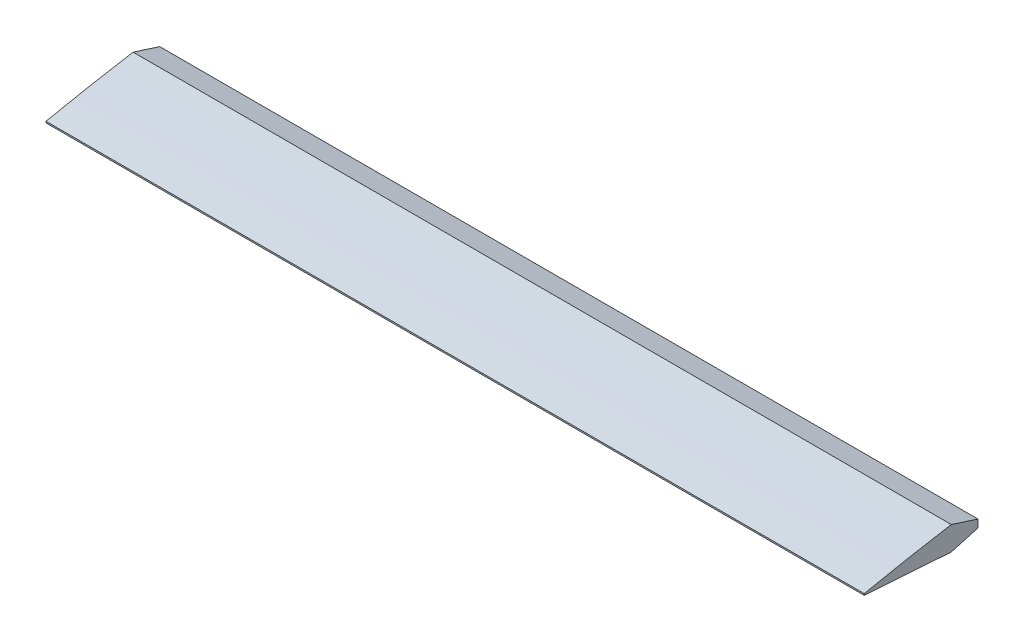
ISO-10303-21;
HEADER;
FILE_DESCRIPTION(('STEP AP214'),'2;1');
FILE_NAME('part.step','',(''),(''),'','','');
FILE_SCHEMA(('AUTOMOTIVE_DESIGN { 1 0 10303 214 1 1 1 1 }'));
ENDSEC;
DATA;
#1=APPLICATION_CONTEXT('core data for automotive mechanical design processes');
#2=APPLICATION_PROTOCOL_DEFINITION('international standard','automotive_design',2000,#1);
#3=PRODUCT_CONTEXT('',#1,'mechanical');
#4=PRODUCT('Part','Part','',(#3));
#5=PRODUCT_RELATED_PRODUCT_CATEGORY('part','',(#4));
#6=PRODUCT_DEFINITION_FORMATION('','',#4);
#7=PRODUCT_DEFINITION_CONTEXT('part definition',#1,'design');
#8=PRODUCT_DEFINITION('design','',#6,#7);
#9=PRODUCT_DEFINITION_SHAPE('','',#8);
#10=(LENGTH_UNIT() NAMED_UNIT(*) SI_UNIT(.MILLI.,.METRE.));
#11=(NAMED_UNIT(*) PLANE_ANGLE_UNIT() SI_UNIT($,.RADIAN.));
#12=(NAMED_UNIT(*) SI_UNIT($,.STERADIAN.) SOLID_ANGLE_UNIT());
#13=UNCERTAINTY_MEASURE_WITH_UNIT(LENGTH_MEASURE(1.E-05),#10,'distance_accuracy_value','');
#14=(GEOMETRIC_REPRESENTATION_CONTEXT(3) GLOBAL_UNCERTAINTY_ASSIGNED_CONTEXT((#13)) GLOBAL_UNIT_ASSIGNED_CONTEXT((#10,
#11,#12)) REPRESENTATION_CONTEXT('',''));
#15=CARTESIAN_POINT('',(0.,0.,0.));
#16=DIRECTION('',(0.,0.,1.));
#17=DIRECTION('',(1.,0.,0.));
#18=AXIS2_PLACEMENT_3D('',#15,#16,#17);
#19=CARTESIAN_POINT('',(-250.,21.3886732850242,89.));
#20=CARTESIAN_POINT('',(-250.,21.6924393138106,87.5175902156763));
#21=CARTESIAN_POINT('',(-250.,22.2991735538198,84.5566640796384));
#22=CARTESIAN_POINT('',(-250.,23.4104909631112,78.6297269469736));
#23=CARTESIAN_POINT('',(-250.,24.641831569462,71.2170631809324));
#24=CARTESIAN_POINT('',(-250.,25.9162390672229,62.3159799477099));
#25=CARTESIAN_POINT('',(-250.,26.9790478293723,53.4163650243348));
#26=CARTESIAN_POINT('',(-250.,27.757252312656,44.5128917718668));
#27=CARTESIAN_POINT('',(-250.,28.2842497525229,35.6114461447732));
#28=CARTESIAN_POINT('',(-250.,28.3734546736372,28.1847004811248));
#29=CARTESIAN_POINT('',(-250.,28.1277297242642,22.2491575224991));
#30=CARTESIAN_POINT('',(-250.,27.7676716658709,17.7938603249267));
#31=CARTESIAN_POINT('',(-250.,27.1974963055456,13.3329383648118));
#32=CARTESIAN_POINT('',(-250.,26.4953694537602,9.62034210956704));
#33=CARTESIAN_POINT('',(-250.,25.701015566182,6.66058751576171));
#34=CARTESIAN_POINT('',(-250.,24.9788303768218,4.4166755350325));
#35=CARTESIAN_POINT('',(-250.,24.1373761617376,2.51552543990555));
#36=CARTESIAN_POINT('',(-250.,23.1172060054036,0.875610555548998));
#37=CARTESIAN_POINT('',(-250.,21.3529663487488,-0.554450875401541));
#38=CARTESIAN_POINT('',(-250.,19.8022315361252,0.931001928104729));
#39=CARTESIAN_POINT('',(-250.,19.0949550918379,2.54024256096899));
#40=CARTESIAN_POINT('',(-250.,18.5577036137218,4.43302859202716));
#41=CARTESIAN_POINT('',(-250.,18.1724928525861,6.66955299200507));
#42=CARTESIAN_POINT('',(-250.,17.8437583770492,9.64115310370391));
#43=CARTESIAN_POINT('',(-250.,17.590735707999,13.3504314681179));
#44=CARTESIAN_POINT('',(-250.,17.4892914666729,17.8043187113869));
#45=CARTESIAN_POINT('',(-250.,17.5034280625483,22.2550272141336));
#46=CARTESIAN_POINT('',(-250.,17.6344002740936,28.1885067397123));
#47=CARTESIAN_POINT('',(-250.,17.8700772068071,35.6060485187279));
#48=CARTESIAN_POINT('',(-250.,18.280226492312,44.5059981210921));
#49=CARTESIAN_POINT('',(-250.,18.8133186654621,53.4033670106579));
#50=CARTESIAN_POINT('',(-250.,19.3674253006102,62.3022449763705));
#51=CARTESIAN_POINT('',(-250.,19.9283008784247,71.2026444966919));
#52=CARTESIAN_POINT('',(-250.,20.4448648269986,78.6172037371231));
#53=CARTESIAN_POINT('',(-250.,20.8433000555565,84.5506800402072));
#54=CARTESIAN_POINT('',(-250.,21.052621242818,87.5168254487195));
#55=CARTESIAN_POINT('',(-250.,21.1572890238036,89.));
#56=B_SPLINE_CURVE_WITH_KNOTS('',3,(#19,#20,#21,#22,#23,#24,#25,#26,#27,#28,#29,#30,#31,#32,#33,
#34,#35,#36,#37,#38,#39,#40,#41,#42,#43,#44,#45,#46,#47,#48,#49,#50,#51,#52,#53,#54,#55),
.UNSPECIFIED.,.F.,.F.,(4,1,1,1,1,1,1,1,1,1,1,1,1,1,1,1,1,1,1,1,1,1,1,1,1,1,1,1,1,1,1,1,1,1,4),
(0.,0.0250124897498648,0.0499592861642578,0.0996729249269686,0.149206319909966,
0.198581096615965,0.247805170456833,0.296916574601493,0.345952721793533,0.370491625569911,
0.395091203654929,0.41981479582396,0.444798575016595,0.457489818915221,0.47040640543549,
0.483879408669829,0.491264120322896,0.503458853294665,0.513609129403887,0.520450990700287,
0.533235387615153,0.545691039147803,0.558031884237173,0.582609167247894,0.607134741746914,
0.631652079836766,0.656174271859652,0.705233949250519,0.754320378530032,0.803437363555032,
0.852566095729537,0.901700994033255,0.950848809337271,0.975422716989279,1.),.UNSPECIFIED.);
#57=DIRECTION('',(1.,0.,0.));
#58=VECTOR('',#57,1.);
#59=SURFACE_OF_LINEAR_EXTRUSION('',#56,#58);
#60=CARTESIAN_POINT('',(-101.,21.3886732850242,89.));
#61=CARTESIAN_POINT('',(-101.,21.6924393138106,87.5175902156763));
#62=CARTESIAN_POINT('',(-101.,22.2991735538198,84.5566640796384));
#63=CARTESIAN_POINT('',(-101.,23.4104909631112,78.6297269469736));
#64=CARTESIAN_POINT('',(-101.,24.641831569462,71.2170631809324));
#65=CARTESIAN_POINT('',(-101.,25.9162390672229,62.3159799477099));
#66=CARTESIAN_POINT('',(-101.,26.9790478293723,53.4163650243348));
#67=CARTESIAN_POINT('',(-101.,27.757252312656,44.5128917718668));
#68=CARTESIAN_POINT('',(-101.,28.2842497525229,35.6114461447732));
#69=CARTESIAN_POINT('',(-101.,28.3734546736372,28.1847004811248));
#70=CARTESIAN_POINT('',(-101.,28.1277297242642,22.2491575224991));
#71=CARTESIAN_POINT('',(-101.,27.7676716658709,17.7938603249267));
#72=CARTESIAN_POINT('',(-101.,27.1974963055456,13.3329383648118));
#73=CARTESIAN_POINT('',(-101.,26.4953694537602,9.62034210956704));
#74=CARTESIAN_POINT('',(-101.,25.701015566182,6.66058751576171));
#75=CARTESIAN_POINT('',(-101.,24.9788303768218,4.4166755350325));
#76=CARTESIAN_POINT('',(-101.,24.1373761617376,2.51552543990555));
#77=CARTESIAN_POINT('',(-101.,23.1172060054036,0.875610555548998));
#78=CARTESIAN_POINT('',(-101.,21.3529663487488,-0.554450875401541));
#79=CARTESIAN_POINT('',(-101.,19.8022315361252,0.931001928104729));
#80=CARTESIAN_POINT('',(-101.,19.0949550918379,2.54024256096899));
#81=CARTESIAN_POINT('',(-101.,18.5577036137218,4.43302859202716));
#82=CARTESIAN_POINT('',(-101.,18.1724928525861,6.66955299200507));
#83=CARTESIAN_POINT('',(-101.,17.8437583770492,9.64115310370391));
#84=CARTESIAN_POINT('',(-101.,17.590735707999,13.3504314681179));
#85=CARTESIAN_POINT('',(-101.,17.4892914666729,17.8043187113869));
#86=CARTESIAN_POINT('',(-101.,17.5034280625483,22.2550272141336));
#87=CARTESIAN_POINT('',(-101.,17.6344002740936,28.1885067397123));
#88=CARTESIAN_POINT('',(-101.,17.8700772068071,35.6060485187279));
#89=CARTESIAN_POINT('',(-101.,18.280226492312,44.5059981210921));
#90=CARTESIAN_POINT('',(-101.,18.8133186654621,53.4033670106579));
#91=CARTESIAN_POINT('',(-101.,19.3674253006102,62.3022449763705));
#92=CARTESIAN_POINT('',(-101.,19.9283008784247,71.2026444966919));
#93=CARTESIAN_POINT('',(-101.,20.4448648269986,78.6172037371231));
#94=CARTESIAN_POINT('',(-101.,20.8433000555565,84.5506800402072));
#95=CARTESIAN_POINT('',(-101.,21.052621242818,87.5168254487195));
#96=CARTESIAN_POINT('',(-101.,21.1572890238036,89.));
#97=B_SPLINE_CURVE_WITH_KNOTS('',3,(#60,#61,#62,#63,#64,#65,#66,#67,#68,#69,#70,#71,#72,#73,#74,
#75,#76,#77,#78,#79,#80,#81,#82,#83,#84,#85,#86,#87,#88,#89,#90,#91,#92,#93,#94,#95,#96),
.UNSPECIFIED.,.F.,.F.,(4,1,1,1,1,1,1,1,1,1,1,1,1,1,1,1,1,1,1,1,1,1,1,1,1,1,1,1,1,1,1,1,1,1,4),
(0.,0.0250124897498648,0.0499592861642578,0.0996729249269686,0.149206319909966,
0.198581096615965,0.247805170456833,0.296916574601493,0.345952721793533,0.370491625569911,
0.395091203654929,0.41981479582396,0.444798575016595,0.457489818915221,0.47040640543549,
0.483879408669829,0.491264120322896,0.503458853294665,0.513609129403887,0.520450990700287,
0.533235387615153,0.545691039147803,0.558031884237173,0.582609167247894,0.607134741746914,
0.631652079836766,0.656174271859652,0.705233949250519,0.754320378530032,0.803437363555032,
0.852566095729537,0.901700994033255,0.950848809337271,0.975422716989279,1.),.UNSPECIFIED.);
#98=CARTESIAN_POINT('',(-101.,21.3886732850242,89.));
#99=VERTEX_POINT('',#98);
#100=CARTESIAN_POINT('',(-101.,23.9416394535555,75.375229743475));
#101=VERTEX_POINT('',#100);
#102=EDGE_CURVE('E127',#99,#101,#97,.T.);
#103=ORIENTED_EDGE('',*,*,#102,.T.);
#104=DIRECTION('',(-1.,0.,0.));
#105=VECTOR('',#104,1.);
#106=CARTESIAN_POINT('',(-101.,23.941639457081,75.3752297227453));
#107=LINE('',#106,#105);
#108=CARTESIAN_POINT('',(-229.,23.941639457081,75.3752297227453));
#109=VERTEX_POINT('',#108);
#110=EDGE_CURVE('E70',#101,#109,#107,.T.);
#111=ORIENTED_EDGE('',*,*,#110,.T.);
#112=CARTESIAN_POINT('',(-229.,21.3886732850242,89.));
#113=CARTESIAN_POINT('',(-229.,21.6924393138106,87.5175902156763));
#114=CARTESIAN_POINT('',(-229.,22.2991735538198,84.5566640796384));
#115=CARTESIAN_POINT('',(-229.,23.4104909631112,78.6297269469736));
#116=CARTESIAN_POINT('',(-229.,24.641831569462,71.2170631809324));
#117=CARTESIAN_POINT('',(-229.,25.9162390672229,62.3159799477099));
#118=CARTESIAN_POINT('',(-229.,26.9790478293723,53.4163650243348));
#119=CARTESIAN_POINT('',(-229.,27.757252312656,44.5128917718668));
#120=CARTESIAN_POINT('',(-229.,28.2842497525229,35.6114461447732));
#121=CARTESIAN_POINT('',(-229.,28.3734546736372,28.1847004811248));
#122=CARTESIAN_POINT('',(-229.,28.1277297242642,22.2491575224991));
#123=CARTESIAN_POINT('',(-229.,27.7676716658709,17.7938603249267));
#124=CARTESIAN_POINT('',(-229.,27.1974963055456,13.3329383648118));
#125=CARTESIAN_POINT('',(-229.,26.4953694537602,9.62034210956704));
#126=CARTESIAN_POINT('',(-229.,25.701015566182,6.66058751576171));
#127=CARTESIAN_POINT('',(-229.,24.9788303768218,4.4166755350325));
#128=CARTESIAN_POINT('',(-229.,24.1373761617376,2.51552543990555));
#129=CARTESIAN_POINT('',(-229.,23.1172060054036,0.875610555548998));
#130=CARTESIAN_POINT('',(-229.,21.3529663487488,-0.554450875401541));
#131=CARTESIAN_POINT('',(-229.,19.8022315361252,0.931001928104729));
#132=CARTESIAN_POINT('',(-229.,19.0949550918379,2.54024256096899));
#133=CARTESIAN_POINT('',(-229.,18.5577036137218,4.43302859202716));
#134=CARTESIAN_POINT('',(-229.,18.1724928525861,6.66955299200507));
#135=CARTESIAN_POINT('',(-229.,17.8437583770492,9.64115310370391));
#136=CARTESIAN_POINT('',(-229.,17.590735707999,13.3504314681179));
#137=CARTESIAN_POINT('',(-229.,17.4892914666729,17.8043187113869));
#138=CARTESIAN_POINT('',(-229.,17.5034280625483,22.2550272141336));
#139=CARTESIAN_POINT('',(-229.,17.6344002740936,28.1885067397123));
#140=CARTESIAN_POINT('',(-229.,17.8700772068071,35.6060485187279));
#141=CARTESIAN_POINT('',(-229.,18.280226492312,44.5059981210921));
#142=CARTESIAN_POINT('',(-229.,18.8133186654621,53.4033670106579));
#143=CARTESIAN_POINT('',(-229.,19.3674253006102,62.3022449763705));
#144=CARTESIAN_POINT('',(-229.,19.9283008784247,71.2026444966919));
#145=CARTESIAN_POINT('',(-229.,20.4448648269986,78.6172037371231));
#146=CARTESIAN_POINT('',(-229.,20.8433000555565,84.5506800402072));
#147=CARTESIAN_POINT('',(-229.,21.052621242818,87.5168254487195));
#148=CARTESIAN_POINT('',(-229.,21.1572890238036,89.));
#149=B_SPLINE_CURVE_WITH_KNOTS('',3,(#112,#113,#114,#115,#116,#117,#118,#119,#120,#121,#122,
#123,#124,#125,#126,#127,#128,#129,#130,#131,#132,#133,#134,#135,#136,#137,#138,#139,#140,#141,
#142,#143,#144,#145,#146,#147,#148),.UNSPECIFIED.,.F.,.F.,(4,1,1,1,1,1,1,1,1,1,1,1,1,1,1,1,1,1,
1,1,1,1,1,1,1,1,1,1,1,1,1,1,1,1,4),(0.,0.0250124897498648,0.0499592861642578,0.0996729249269686,
0.149206319909966,0.198581096615965,0.247805170456833,0.296916574601493,0.345952721793533,
0.370491625569911,0.395091203654929,0.41981479582396,0.444798575016595,0.457489818915221,
0.47040640543549,0.483879408669829,0.491264120322896,0.503458853294665,0.513609129403887,
0.520450990700287,0.533235387615153,0.545691039147803,0.558031884237173,0.582609167247894,
0.607134741746914,0.631652079836766,0.656174271859652,0.705233949250519,0.754320378530032,
0.803437363555032,0.852566095729537,0.901700994033255,0.950848809337271,0.975422716989279,1.),.UNSPECIFIED.);
#150=CARTESIAN_POINT('',(-229.,21.3886732850242,89.));
#151=VERTEX_POINT('',#150);
#152=EDGE_CURVE('E131',#109,#151,#149,.F.);
#153=ORIENTED_EDGE('',*,*,#152,.T.);
#154=DIRECTION('',(1.,0.,0.));
#155=VECTOR('',#154,1.);
#156=CARTESIAN_POINT('',(-250.,21.3886732850242,89.));
#157=LINE('',#156,#155);
#158=EDGE_CURVE('E63',#151,#99,#157,.T.);
#159=ORIENTED_EDGE('',*,*,#158,.T.);
#160=EDGE_LOOP('',(#103,#111,#153,#159));
#161=FACE_BOUND('',#160,.T.);
#162=ADVANCED_FACE('F54',(#161),#59,.F.);
#163=CARTESIAN_POINT('',(-229.,21.1572890238036,89.));
#164=VERTEX_POINT('',#163);
#165=CARTESIAN_POINT('',(-229.,20.2199641203431,75.3752297229802));
#166=VERTEX_POINT('',#165);
#167=EDGE_CURVE('E122',#164,#166,#149,.F.);
#168=ORIENTED_EDGE('',*,*,#167,.T.);
#169=DIRECTION('',(-1.,0.,0.));
#170=VECTOR('',#169,1.);
#171=CARTESIAN_POINT('',(-101.,20.2199641203431,75.3752297229802));
#172=LINE('',#171,#170);
#173=CARTESIAN_POINT('',(-101.,20.2199641203431,75.3752297229802));
#174=VERTEX_POINT('',#173);
#175=EDGE_CURVE('E108',#174,#166,#172,.T.);
#176=ORIENTED_EDGE('',*,*,#175,.F.);
#177=CARTESIAN_POINT('',(-101.,21.1572890238036,89.));
#178=VERTEX_POINT('',#177);
#179=EDGE_CURVE('E120',#174,#178,#97,.T.);
#180=ORIENTED_EDGE('',*,*,#179,.T.);
#181=DIRECTION('',(1.,0.,0.));
#182=VECTOR('',#181,1.);
#183=CARTESIAN_POINT('',(-250.,21.1572890238036,89.));
#184=LINE('',#183,#182);
#185=EDGE_CURVE('E12',#164,#178,#184,.T.);
#186=ORIENTED_EDGE('',*,*,#185,.F.);
#187=EDGE_LOOP('',(#168,#176,#180,#186));
#188=FACE_BOUND('',#187,.T.);
#189=ADVANCED_FACE('F118',(#188),#59,.F.);
#190=CARTESIAN_POINT('',(0.,0.,89.));
#191=DIRECTION('',(0.,0.,1.));
#192=DIRECTION('',(1.,0.,0.));
#193=AXIS2_PLACEMENT_3D('',#190,#191,#192);
#194=PLANE('',#193);
#195=DIRECTION('',(0.,1.,0.));
#196=VECTOR('',#195,1.);
#197=CARTESIAN_POINT('',(-229.,17.4691352699566,89.));
#198=LINE('',#197,#196);
#199=EDGE_CURVE('E133',#164,#151,#198,.T.);
#200=ORIENTED_EDGE('',*,*,#199,.F.);
#201=ORIENTED_EDGE('',*,*,#185,.T.);
#202=DIRECTION('',(0.,1.,0.));
#203=VECTOR('',#202,1.);
#204=CARTESIAN_POINT('',(-101.,17.4691352699566,89.));
#205=LINE('',#204,#203);
#206=EDGE_CURVE('E126',#178,#99,#205,.T.);
#207=ORIENTED_EDGE('',*,*,#206,.T.);
#208=ORIENTED_EDGE('',*,*,#158,.F.);
#209=EDGE_LOOP('',(#200,#201,#207,#208));
#210=FACE_BOUND('',#209,.T.);
#211=ADVANCED_FACE('F56',(#210),#194,.T.);
#212=CARTESIAN_POINT('',(-229.,17.4691352699566,71.2));
#213=DIRECTION('',(0.,0.,1.));
#214=DIRECTION('',(1.,0.,0.));
#215=AXIS2_PLACEMENT_3D('',#212,#213,#214);
#216=PLANE('',#215);
#217=DIRECTION('',(0.,1.,0.));
#218=VECTOR('',#217,1.);
#219=CARTESIAN_POINT('',(-101.,17.4691352699566,71.2));
#220=LINE('',#219,#218);
#221=CARTESIAN_POINT('',(-101.,21.3930593438665,71.2));
#222=VERTEX_POINT('',#221);
#223=CARTESIAN_POINT('',(-101.,22.5975463968663,71.2));
#224=VERTEX_POINT('',#223);
#225=EDGE_CURVE('E139',#222,#224,#220,.T.);
#226=ORIENTED_EDGE('',*,*,#225,.F.);
#227=DIRECTION('',(-1.,0.,0.));
#228=VECTOR('',#227,1.);
#229=CARTESIAN_POINT('',(-101.,21.3930593438665,71.2));
#230=LINE('',#229,#228);
#231=CARTESIAN_POINT('',(-229.,21.3930593438665,71.2));
#232=VERTEX_POINT('',#231);
#233=EDGE_CURVE('E78',#222,#232,#230,.T.);
#234=ORIENTED_EDGE('',*,*,#233,.T.);
#235=DIRECTION('',(0.,1.,0.));
#236=VECTOR('',#235,1.);
#237=CARTESIAN_POINT('',(-229.,17.4691352699566,71.2));
#238=LINE('',#237,#236);
#239=CARTESIAN_POINT('',(-229.,22.5975463968663,71.2));
#240=VERTEX_POINT('',#239);
#241=EDGE_CURVE('E128',#232,#240,#238,.T.);
#242=ORIENTED_EDGE('',*,*,#241,.T.);
#243=DIRECTION('',(-1.,0.,0.));
#244=VECTOR('',#243,1.);
#245=CARTESIAN_POINT('',(-101.,22.5975463968663,71.2));
#246=LINE('',#245,#244);
#247=EDGE_CURVE('E191',#224,#240,#246,.T.);
#248=ORIENTED_EDGE('',*,*,#247,.F.);
#249=EDGE_LOOP('',(#226,#234,#242,#248));
#250=FACE_BOUND('',#249,.T.);
#251=ADVANCED_FACE('F160',(#250),#216,.F.);
#252=CARTESIAN_POINT('',(-229.,17.4691352699566,89.));
#253=DIRECTION('',(1.,0.,0.));
#254=DIRECTION('',(0.,0.,-1.));
#255=AXIS2_PLACEMENT_3D('',#252,#253,#254);
#256=PLANE('',#255);
#257=ORIENTED_EDGE('',*,*,#241,.F.);
#258=DIRECTION('',(0.,0.270491689824604,-0.962722309773608));
#259=VECTOR('',#258,1.);
#260=CARTESIAN_POINT('',(-229.,21.3930593438665,71.2));
#261=LINE('',#260,#259);
#262=EDGE_CURVE('E114',#166,#232,#261,.T.);
#263=ORIENTED_EDGE('',*,*,#262,.F.);
#264=ORIENTED_EDGE('',*,*,#167,.F.);
#265=ORIENTED_EDGE('',*,*,#199,.T.);
#266=ORIENTED_EDGE('',*,*,#152,.F.);
#267=DIRECTION('',(0.,0.306433774766558,0.951891980049374));
#268=VECTOR('',#267,1.);
#269=CARTESIAN_POINT('',(-229.,22.5975463968663,71.2));
#270=LINE('',#269,#268);
#271=EDGE_CURVE('E190',#240,#109,#270,.T.);
#272=ORIENTED_EDGE('',*,*,#271,.F.);
#273=EDGE_LOOP('',(#257,#263,#264,#265,#266,#272));
#274=FACE_BOUND('',#273,.T.);
#275=ADVANCED_FACE('F163',(#274),#256,.F.);
#276=CARTESIAN_POINT('',(-101.,17.4691352699566,71.2));
#277=DIRECTION('',(-1.,0.,0.));
#278=DIRECTION('',(0.,0.,1.));
#279=AXIS2_PLACEMENT_3D('',#276,#277,#278);
#280=PLANE('',#279);
#281=ORIENTED_EDGE('',*,*,#179,.F.);
#282=DIRECTION('',(0.,0.270491689824604,-0.962722309773608));
#283=VECTOR('',#282,1.);
#284=CARTESIAN_POINT('',(-101.,21.3930593438665,71.2));
#285=LINE('',#284,#283);
#286=EDGE_CURVE('E105',#174,#222,#285,.T.);
#287=ORIENTED_EDGE('',*,*,#286,.T.);
#288=ORIENTED_EDGE('',*,*,#225,.T.);
#289=DIRECTION('',(0.,0.306433774766558,0.951891980049374));
#290=VECTOR('',#289,1.);
#291=CARTESIAN_POINT('',(-101.,22.5975463968663,71.2));
#292=LINE('',#291,#290);
#293=EDGE_CURVE('E183',#224,#101,#292,.T.);
#294=ORIENTED_EDGE('',*,*,#293,.T.);
#295=ORIENTED_EDGE('',*,*,#102,.F.);
#296=ORIENTED_EDGE('',*,*,#206,.F.);
#297=EDGE_LOOP('',(#281,#287,#288,#294,#295,#296));
#298=FACE_BOUND('',#297,.T.);
#299=ADVANCED_FACE('F124',(#298),#280,.F.);
#300=CARTESIAN_POINT('',(-101.,22.5975463968663,71.2));
#301=DIRECTION('',(0.,-0.951891980049374,0.306433774766558));
#302=DIRECTION('',(0.,-0.306433774766558,-0.951891980049375));
#303=AXIS2_PLACEMENT_3D('',#300,#301,#302);
#304=PLANE('',#303);
#305=ORIENTED_EDGE('',*,*,#271,.T.);
#306=ORIENTED_EDGE('',*,*,#110,.F.);
#307=ORIENTED_EDGE('',*,*,#293,.F.);
#308=ORIENTED_EDGE('',*,*,#247,.T.);
#309=EDGE_LOOP('',(#305,#306,#307,#308));
#310=FACE_BOUND('',#309,.T.);
#311=ADVANCED_FACE('F167',(#310),#304,.F.);
#312=CARTESIAN_POINT('',(-101.,21.3930593438665,71.2));
#313=DIRECTION('',(0.,0.962722309773608,0.270491689824604));
#314=DIRECTION('',(0.,-0.270491689824604,0.962722309773608));
#315=AXIS2_PLACEMENT_3D('',#312,#313,#314);
#316=PLANE('',#315);
#317=ORIENTED_EDGE('',*,*,#262,.T.);
#318=ORIENTED_EDGE('',*,*,#233,.F.);
#319=ORIENTED_EDGE('',*,*,#286,.F.);
#320=ORIENTED_EDGE('',*,*,#175,.T.);
#321=EDGE_LOOP('',(#317,#318,#319,#320));
#322=FACE_BOUND('',#321,.T.);
#323=ADVANCED_FACE('F107',(#322),#316,.F.);
#324=CLOSED_SHELL('',(#162,#189,#211,#251,#275,#299,#311,#323));
#325=MANIFOLD_SOLID_BREP('B2',#324);
#326=ADVANCED_BREP_SHAPE_REPRESENTATION('',(#18,#325),#14);
#327=SHAPE_DEFINITION_REPRESENTATION(#9,#326);
ENDSEC;
END-ISO-10303-21;
